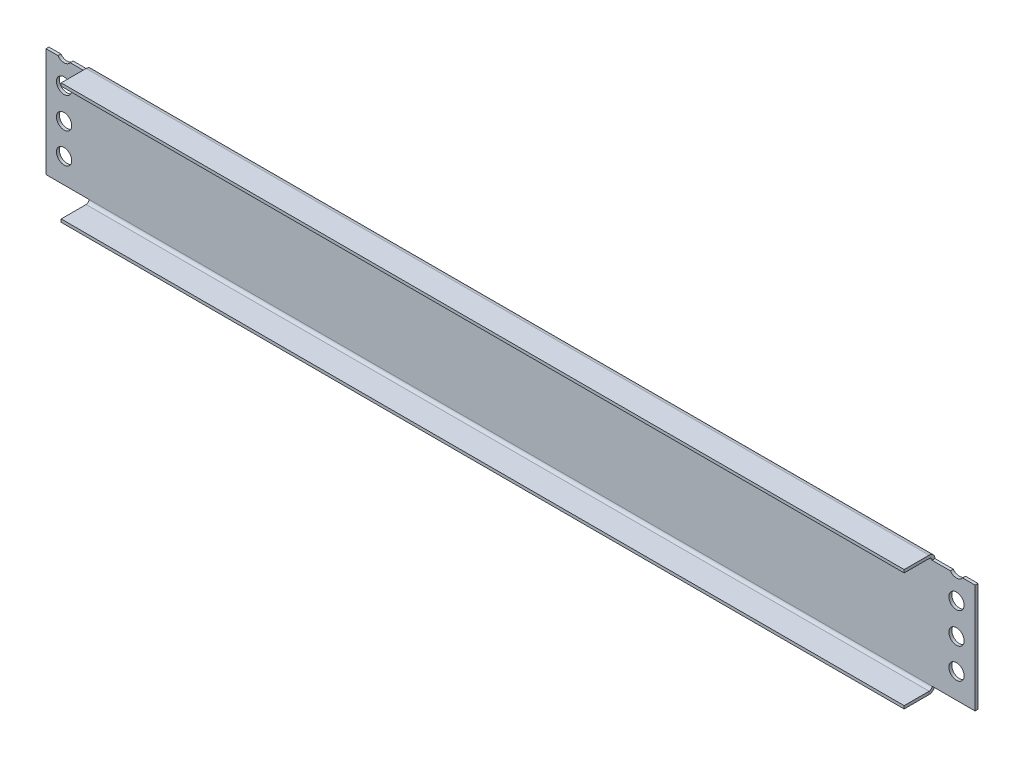
ISO-10303-21;
HEADER;
FILE_DESCRIPTION(('STEP AP214'),'2;1');
FILE_NAME('part.step','',(''),(''),'','','');
FILE_SCHEMA(('AUTOMOTIVE_DESIGN { 1 0 10303 214 1 1 1 1 }'));
ENDSEC;
DATA;
#1=APPLICATION_CONTEXT('core data for automotive mechanical design processes');
#2=APPLICATION_PROTOCOL_DEFINITION('international standard','automotive_design',2000,#1);
#3=PRODUCT_CONTEXT('',#1,'mechanical');
#4=PRODUCT('Part','Part','',(#3));
#5=PRODUCT_RELATED_PRODUCT_CATEGORY('part','',(#4));
#6=PRODUCT_DEFINITION_FORMATION('','',#4);
#7=PRODUCT_DEFINITION_CONTEXT('part definition',#1,'design');
#8=PRODUCT_DEFINITION('design','',#6,#7);
#9=PRODUCT_DEFINITION_SHAPE('','',#8);
#10=(LENGTH_UNIT() NAMED_UNIT(*) SI_UNIT(.MILLI.,.METRE.));
#11=(NAMED_UNIT(*) PLANE_ANGLE_UNIT() SI_UNIT($,.RADIAN.));
#12=(NAMED_UNIT(*) SI_UNIT($,.STERADIAN.) SOLID_ANGLE_UNIT());
#13=UNCERTAINTY_MEASURE_WITH_UNIT(LENGTH_MEASURE(1.E-05),#10,'distance_accuracy_value','');
#14=(GEOMETRIC_REPRESENTATION_CONTEXT(3) GLOBAL_UNCERTAINTY_ASSIGNED_CONTEXT((#13)) GLOBAL_UNIT_ASSIGNED_CONTEXT((#10,
#11,#12)) REPRESENTATION_CONTEXT('',''));
#15=CARTESIAN_POINT('',(0.,0.,0.));
#16=DIRECTION('',(0.,0.,1.));
#17=DIRECTION('',(1.,0.,0.));
#18=AXIS2_PLACEMENT_3D('',#15,#16,#17);
#19=CARTESIAN_POINT('',(0.,28.321,0.));
#20=DIRECTION('',(0.,1.,0.));
#21=DIRECTION('',(0.,0.,1.));
#22=AXIS2_PLACEMENT_3D('',#19,#20,#21);
#23=PLANE('',#22);
#24=DIRECTION('',(0.,0.,1.));
#25=VECTOR('',#24,1.);
#26=CARTESIAN_POINT('',(-235.089067467124,28.321,-2.794));
#27=LINE('',#26,#25);
#28=CARTESIAN_POINT('',(-235.089067467124,28.321,-1.524));
#29=VERTEX_POINT('',#28);
#30=CARTESIAN_POINT('',(-235.089067467124,28.321,0.));
#31=VERTEX_POINT('',#30);
#32=EDGE_CURVE('E13',#29,#31,#27,.T.);
#33=ORIENTED_EDGE('',*,*,#32,.F.);
#34=DIRECTION('',(-1.,0.,0.));
#35=VECTOR('',#34,1.);
#36=CARTESIAN_POINT('',(-241.3,28.321,-1.52400000000001));
#37=LINE('',#36,#35);
#38=CARTESIAN_POINT('',(-241.3,28.321,-1.52400000000001));
#39=VERTEX_POINT('',#38);
#40=EDGE_CURVE('E254',#39,#29,#37,.F.);
#41=ORIENTED_EDGE('',*,*,#40,.F.);
#42=DIRECTION('',(0.,0.,-1.));
#43=VECTOR('',#42,1.);
#44=CARTESIAN_POINT('',(-241.3,28.321,0.));
#45=LINE('',#44,#43);
#46=CARTESIAN_POINT('',(-241.3,28.321,0.));
#47=VERTEX_POINT('',#46);
#48=EDGE_CURVE('E259',#47,#39,#45,.T.);
#49=ORIENTED_EDGE('',*,*,#48,.F.);
#50=DIRECTION('',(-1.,0.,0.));
#51=VECTOR('',#50,1.);
#52=CARTESIAN_POINT('',(-241.3,28.321,0.));
#53=LINE('',#52,#51);
#54=EDGE_CURVE('E248',#47,#31,#53,.F.);
#55=ORIENTED_EDGE('',*,*,#54,.T.);
#56=EDGE_LOOP('',(#33,#41,#49,#55));
#57=FACE_BOUND('',#56,.T.);
#58=ADVANCED_FACE('F87',(#57),#23,.T.);
#59=CARTESIAN_POINT('',(0.,28.321,0.));
#60=DIRECTION('',(0.,1.,0.));
#61=DIRECTION('',(0.,0.,1.));
#62=AXIS2_PLACEMENT_3D('',#59,#60,#61);
#63=PLANE('',#62);
#64=DIRECTION('',(0.,0.,1.));
#65=VECTOR('',#64,1.);
#66=CARTESIAN_POINT('',(228.460932532876,28.321,-2.794));
#67=LINE('',#66,#65);
#68=CARTESIAN_POINT('',(228.460932532876,28.321,-1.524));
#69=VERTEX_POINT('',#68);
#70=CARTESIAN_POINT('',(228.460932532876,28.321,0.));
#71=VERTEX_POINT('',#70);
#72=EDGE_CURVE('E221',#69,#71,#67,.T.);
#73=ORIENTED_EDGE('',*,*,#72,.F.);
#74=DIRECTION('',(-1.,0.,0.));
#75=VECTOR('',#74,1.);
#76=CARTESIAN_POINT('',(218.948,28.321,-1.52400000000001));
#77=LINE('',#76,#75);
#78=CARTESIAN_POINT('',(218.948,28.321,-1.52400000000001));
#79=VERTEX_POINT('',#78);
#80=EDGE_CURVE('E309',#69,#79,#77,.T.);
#81=ORIENTED_EDGE('',*,*,#80,.T.);
#82=DIRECTION('',(0.,0.,1.));
#83=VECTOR('',#82,1.);
#84=CARTESIAN_POINT('',(218.948,28.321,-1.52400000000001));
#85=LINE('',#84,#83);
#86=CARTESIAN_POINT('',(218.948,28.321,0.));
#87=VERTEX_POINT('',#86);
#88=EDGE_CURVE('E244',#79,#87,#85,.T.);
#89=ORIENTED_EDGE('',*,*,#88,.T.);
#90=EDGE_CURVE('E236',#87,#71,#53,.F.);
#91=ORIENTED_EDGE('',*,*,#90,.T.);
#92=EDGE_LOOP('',(#73,#81,#89,#91));
#93=FACE_BOUND('',#92,.T.);
#94=ADVANCED_FACE('F242',(#93),#63,.T.);
#95=CARTESIAN_POINT('',(218.948,-28.321,14.478));
#96=DIRECTION('',(-1.,0.,0.));
#97=DIRECTION('',(0.,0.,1.));
#98=AXIS2_PLACEMENT_3D('',#95,#96,#97);
#99=PLANE('',#98);
#100=DIRECTION('',(0.,0.,-1.));
#101=VECTOR('',#100,1.);
#102=CARTESIAN_POINT('',(218.948,-31.369,14.478));
#103=LINE('',#102,#101);
#104=CARTESIAN_POINT('',(218.948,-31.369,14.478));
#105=VERTEX_POINT('',#104);
#106=CARTESIAN_POINT('',(218.948,-31.369,1.52399999999999));
#107=VERTEX_POINT('',#106);
#108=EDGE_CURVE('E483',#105,#107,#103,.T.);
#109=ORIENTED_EDGE('',*,*,#108,.T.);
#110=DIRECTION('',(0.,1.,0.));
#111=VECTOR('',#110,1.);
#112=CARTESIAN_POINT('',(218.948,-31.369,1.52399999999999));
#113=LINE('',#112,#111);
#114=CARTESIAN_POINT('',(218.948,-29.845,1.52399999999999));
#115=VERTEX_POINT('',#114);
#116=EDGE_CURVE('E286',#107,#115,#113,.T.);
#117=ORIENTED_EDGE('',*,*,#116,.T.);
#118=DIRECTION('',(0.,0.,-1.));
#119=VECTOR('',#118,1.);
#120=CARTESIAN_POINT('',(218.948,-29.845,-1.05239890875926E-13));
#121=LINE('',#120,#119);
#122=CARTESIAN_POINT('',(218.948,-29.845,14.478));
#123=VERTEX_POINT('',#122);
#124=EDGE_CURVE('E474',#123,#115,#121,.T.);
#125=ORIENTED_EDGE('',*,*,#124,.F.);
#126=DIRECTION('',(0.,1.,0.));
#127=VECTOR('',#126,1.);
#128=CARTESIAN_POINT('',(218.948,-31.369,14.478));
#129=LINE('',#128,#127);
#130=EDGE_CURVE('E280',#105,#123,#129,.T.);
#131=ORIENTED_EDGE('',*,*,#130,.F.);
#132=EDGE_LOOP('',(#109,#117,#125,#131));
#133=FACE_BOUND('',#132,.T.);
#134=ADVANCED_FACE('F499',(#133),#99,.F.);
#135=CARTESIAN_POINT('',(-218.948,28.321,-1.52400000000001));
#136=DIRECTION('',(1.,0.,0.));
#137=DIRECTION('',(0.,0.,-1.));
#138=AXIS2_PLACEMENT_3D('',#135,#136,#137);
#139=PLANE('',#138);
#140=DIRECTION('',(0.,0.,1.));
#141=VECTOR('',#140,1.);
#142=CARTESIAN_POINT('',(-218.948,31.369,-1.10560908436323E-13));
#143=LINE('',#142,#141);
#144=CARTESIAN_POINT('',(-218.948,31.369,1.52399999999998));
#145=VERTEX_POINT('',#144);
#146=CARTESIAN_POINT('',(-218.948,31.3690000000001,14.478));
#147=VERTEX_POINT('',#146);
#148=EDGE_CURVE('E411',#145,#147,#143,.T.);
#149=ORIENTED_EDGE('',*,*,#148,.F.);
#150=DIRECTION('',(0.,-1.,0.));
#151=VECTOR('',#150,1.);
#152=CARTESIAN_POINT('',(-218.948,31.369,1.52399999999998));
#153=LINE('',#152,#151);
#154=CARTESIAN_POINT('',(-218.948,29.845,1.52399999999999));
#155=VERTEX_POINT('',#154);
#156=EDGE_CURVE('E278',#145,#155,#153,.T.);
#157=ORIENTED_EDGE('',*,*,#156,.T.);
#158=DIRECTION('',(0.,0.,1.));
#159=VECTOR('',#158,1.);
#160=CARTESIAN_POINT('',(-218.948,29.845,-1.05239890875926E-13));
#161=LINE('',#160,#159);
#162=CARTESIAN_POINT('',(-218.948,29.8450000000001,14.478));
#163=VERTEX_POINT('',#162);
#164=EDGE_CURVE('E408',#155,#163,#161,.T.);
#165=ORIENTED_EDGE('',*,*,#164,.T.);
#166=DIRECTION('',(0.,-1.,0.));
#167=VECTOR('',#166,1.);
#168=CARTESIAN_POINT('',(-218.948,31.3690000000001,14.478));
#169=LINE('',#168,#167);
#170=EDGE_CURVE('E269',#147,#163,#169,.T.);
#171=ORIENTED_EDGE('',*,*,#170,.F.);
#172=EDGE_LOOP('',(#149,#157,#165,#171));
#173=FACE_BOUND('',#172,.T.);
#174=ADVANCED_FACE('F427',(#173),#139,.F.);
#175=CARTESIAN_POINT('',(0.,0.,-1.524));
#176=DIRECTION('',(0.,0.,1.));
#177=DIRECTION('',(1.,0.,0.));
#178=AXIS2_PLACEMENT_3D('',#175,#176,#177);
#179=PLANE('',#178);
#180=CARTESIAN_POINT('',(231.648,0.380999999999958,-1.524));
#181=DIRECTION('',(0.,0.,1.));
#182=DIRECTION('',(1.,0.,0.));
#183=AXIS2_PLACEMENT_3D('',#180,#181,#182);
#184=CIRCLE('',#183,3.9624);
#185=CARTESIAN_POINT('',(235.6104,0.380999999999958,-1.524));
#186=VERTEX_POINT('',#185);
#187=EDGE_CURVE('E360',#186,#186,#184,.T.);
#188=ORIENTED_EDGE('',*,*,#187,.T.);
#189=EDGE_LOOP('',(#188));
#190=FACE_BOUND('',#189,.T.);
#191=CARTESIAN_POINT('',(231.648,-15.367,-1.524));
#192=DIRECTION('',(0.,0.,1.));
#193=DIRECTION('',(1.,0.,0.));
#194=AXIS2_PLACEMENT_3D('',#191,#192,#193);
#195=CIRCLE('',#194,3.9624);
#196=CARTESIAN_POINT('',(235.6104,-15.367,-1.524));
#197=VERTEX_POINT('',#196);
#198=EDGE_CURVE('E357',#197,#197,#195,.T.);
#199=ORIENTED_EDGE('',*,*,#198,.T.);
#200=EDGE_LOOP('',(#199));
#201=FACE_BOUND('',#200,.T.);
#202=CARTESIAN_POINT('',(-231.902,16.383,-1.524));
#203=DIRECTION('',(0.,0.,1.));
#204=DIRECTION('',(1.,0.,0.));
#205=AXIS2_PLACEMENT_3D('',#202,#203,#204);
#206=CIRCLE('',#205,3.9624);
#207=CARTESIAN_POINT('',(-227.9396,16.383,-1.524));
#208=VERTEX_POINT('',#207);
#209=EDGE_CURVE('E354',#208,#208,#206,.T.);
#210=ORIENTED_EDGE('',*,*,#209,.T.);
#211=EDGE_LOOP('',(#210));
#212=FACE_BOUND('',#211,.T.);
#213=CARTESIAN_POINT('',(-231.902,0.380999999999958,-1.524));
#214=DIRECTION('',(0.,0.,1.));
#215=DIRECTION('',(1.,0.,0.));
#216=AXIS2_PLACEMENT_3D('',#213,#214,#215);
#217=CIRCLE('',#216,3.9624);
#218=CARTESIAN_POINT('',(-227.9396,0.380999999999958,-1.524));
#219=VERTEX_POINT('',#218);
#220=EDGE_CURVE('E351',#219,#219,#217,.T.);
#221=ORIENTED_EDGE('',*,*,#220,.T.);
#222=EDGE_LOOP('',(#221));
#223=FACE_BOUND('',#222,.T.);
#224=CARTESIAN_POINT('',(-231.902,-15.367,-1.524));
#225=DIRECTION('',(0.,0.,1.));
#226=DIRECTION('',(1.,0.,0.));
#227=AXIS2_PLACEMENT_3D('',#224,#225,#226);
#228=CIRCLE('',#227,3.9624);
#229=CARTESIAN_POINT('',(-227.9396,-15.367,-1.524));
#230=VERTEX_POINT('',#229);
#231=EDGE_CURVE('E348',#230,#230,#228,.T.);
#232=ORIENTED_EDGE('',*,*,#231,.T.);
#233=EDGE_LOOP('',(#232));
#234=FACE_BOUND('',#233,.T.);
#235=CARTESIAN_POINT('',(231.648,16.383,-1.524));
#236=DIRECTION('',(0.,0.,1.));
#237=DIRECTION('',(1.,0.,0.));
#238=AXIS2_PLACEMENT_3D('',#235,#236,#237);
#239=CIRCLE('',#238,3.9624);
#240=CARTESIAN_POINT('',(235.6104,16.383,-1.524));
#241=VERTEX_POINT('',#240);
#242=EDGE_CURVE('E345',#241,#241,#239,.T.);
#243=ORIENTED_EDGE('',*,*,#242,.T.);
#244=EDGE_LOOP('',(#243));
#245=FACE_BOUND('',#244,.T.);
#246=ORIENTED_EDGE('',*,*,#40,.T.);
#247=CARTESIAN_POINT('',(-231.902,30.6324,-1.524));
#248=DIRECTION('',(0.,0.,1.));
#249=DIRECTION('',(1.,0.,0.));
#250=AXIS2_PLACEMENT_3D('',#247,#248,#249);
#251=CIRCLE('',#250,3.937);
#252=CARTESIAN_POINT('',(-228.714932532876,28.321,-1.52400000000001));
#253=VERTEX_POINT('',#252);
#254=EDGE_CURVE('E290',#29,#253,#251,.T.);
#255=ORIENTED_EDGE('',*,*,#254,.T.);
#256=CARTESIAN_POINT('',(-218.948,28.321,-1.52400000000001));
#257=VERTEX_POINT('',#256);
#258=EDGE_CURVE('E299',#253,#257,#37,.F.);
#259=ORIENTED_EDGE('',*,*,#258,.T.);
#260=EDGE_CURVE('E253',#257,#79,#37,.F.);
#261=ORIENTED_EDGE('',*,*,#260,.T.);
#262=ORIENTED_EDGE('',*,*,#80,.F.);
#263=CARTESIAN_POINT('',(231.648,30.6324,-1.524));
#264=DIRECTION('',(0.,0.,1.));
#265=DIRECTION('',(1.,0.,0.));
#266=AXIS2_PLACEMENT_3D('',#263,#264,#265);
#267=CIRCLE('',#266,3.937);
#268=CARTESIAN_POINT('',(234.835067467124,28.321,-1.52400000000001));
#269=VERTEX_POINT('',#268);
#270=EDGE_CURVE('E224',#69,#269,#267,.T.);
#271=ORIENTED_EDGE('',*,*,#270,.T.);
#272=CARTESIAN_POINT('',(241.3,28.321,-1.52400000000001));
#273=VERTEX_POINT('',#272);
#274=EDGE_CURVE('E413',#273,#269,#77,.T.);
#275=ORIENTED_EDGE('',*,*,#274,.F.);
#276=DIRECTION('',(0.,1.,0.));
#277=VECTOR('',#276,1.);
#278=CARTESIAN_POINT('',(241.3,31.369,-1.524));
#279=LINE('',#278,#277);
#280=CARTESIAN_POINT('',(241.3,-28.321,-1.524));
#281=VERTEX_POINT('',#280);
#282=EDGE_CURVE('E262',#281,#273,#279,.T.);
#283=ORIENTED_EDGE('',*,*,#282,.F.);
#284=DIRECTION('',(1.,0.,0.));
#285=VECTOR('',#284,1.);
#286=CARTESIAN_POINT('',(241.3,-28.321,-1.524));
#287=LINE('',#286,#285);
#288=CARTESIAN_POINT('',(218.948,-28.321,-1.524));
#289=VERTEX_POINT('',#288);
#290=EDGE_CURVE('E376',#281,#289,#287,.F.);
#291=ORIENTED_EDGE('',*,*,#290,.T.);
#292=CARTESIAN_POINT('',(-218.948,-28.321,-1.524));
#293=VERTEX_POINT('',#292);
#294=EDGE_CURVE('E380',#289,#293,#287,.F.);
#295=ORIENTED_EDGE('',*,*,#294,.T.);
#296=DIRECTION('',(1.,0.,0.));
#297=VECTOR('',#296,1.);
#298=CARTESIAN_POINT('',(-241.3,-28.321,-1.524));
#299=LINE('',#298,#297);
#300=CARTESIAN_POINT('',(-241.3,-28.321,-1.524));
#301=VERTEX_POINT('',#300);
#302=EDGE_CURVE('E472',#301,#293,#299,.T.);
#303=ORIENTED_EDGE('',*,*,#302,.F.);
#304=DIRECTION('',(0.,-1.,0.));
#305=VECTOR('',#304,1.);
#306=CARTESIAN_POINT('',(-241.3,31.369,-1.524));
#307=LINE('',#306,#305);
#308=EDGE_CURVE('E265',#39,#301,#307,.T.);
#309=ORIENTED_EDGE('',*,*,#308,.F.);
#310=EDGE_LOOP('',(#246,#255,#259,#261,#262,#271,#275,#283,#291,#295,#303,#309));
#311=FACE_BOUND('',#310,.T.);
#312=ADVANCED_FACE('F297',(#190,#201,#212,#223,#234,#245,#311),#179,.F.);
#313=CARTESIAN_POINT('',(0.,0.,0.));
#314=DIRECTION('',(0.,0.,1.));
#315=DIRECTION('',(1.,0.,0.));
#316=AXIS2_PLACEMENT_3D('',#313,#314,#315);
#317=PLANE('',#316);
#318=CARTESIAN_POINT('',(-231.902,30.6324,0.));
#319=DIRECTION('',(0.,0.,1.));
#320=DIRECTION('',(1.,0.,0.));
#321=AXIS2_PLACEMENT_3D('',#318,#319,#320);
#322=CIRCLE('',#321,3.937);
#323=CARTESIAN_POINT('',(-228.714932532876,28.321,0.));
#324=VERTEX_POINT('',#323);
#325=EDGE_CURVE('E101',#31,#324,#322,.T.);
#326=ORIENTED_EDGE('',*,*,#325,.F.);
#327=ORIENTED_EDGE('',*,*,#54,.F.);
#328=DIRECTION('',(0.,-1.,0.));
#329=VECTOR('',#328,1.);
#330=CARTESIAN_POINT('',(-241.3,31.369,0.));
#331=LINE('',#330,#329);
#332=CARTESIAN_POINT('',(-241.3,-28.321,0.));
#333=VERTEX_POINT('',#332);
#334=EDGE_CURVE('E266',#47,#333,#331,.T.);
#335=ORIENTED_EDGE('',*,*,#334,.T.);
#336=DIRECTION('',(1.,0.,0.));
#337=VECTOR('',#336,1.);
#338=CARTESIAN_POINT('',(241.3,-28.321,0.));
#339=LINE('',#338,#337);
#340=CARTESIAN_POINT('',(-218.948,-28.321,0.));
#341=VERTEX_POINT('',#340);
#342=EDGE_CURVE('E367',#341,#333,#339,.F.);
#343=ORIENTED_EDGE('',*,*,#342,.F.);
#344=CARTESIAN_POINT('',(218.948,-28.321,0.));
#345=VERTEX_POINT('',#344);
#346=EDGE_CURVE('E383',#345,#341,#339,.F.);
#347=ORIENTED_EDGE('',*,*,#346,.F.);
#348=CARTESIAN_POINT('',(241.3,-28.321,0.));
#349=VERTEX_POINT('',#348);
#350=EDGE_CURVE('E381',#349,#345,#339,.F.);
#351=ORIENTED_EDGE('',*,*,#350,.F.);
#352=DIRECTION('',(0.,1.,0.));
#353=VECTOR('',#352,1.);
#354=CARTESIAN_POINT('',(241.3,31.369,0.));
#355=LINE('',#354,#353);
#356=CARTESIAN_POINT('',(241.3,28.321,0.));
#357=VERTEX_POINT('',#356);
#358=EDGE_CURVE('E258',#349,#357,#355,.T.);
#359=ORIENTED_EDGE('',*,*,#358,.T.);
#360=CARTESIAN_POINT('',(234.835067467124,28.321,0.));
#361=VERTEX_POINT('',#360);
#362=EDGE_CURVE('E239',#361,#357,#53,.F.);
#363=ORIENTED_EDGE('',*,*,#362,.F.);
#364=CARTESIAN_POINT('',(231.648,30.6324,0.));
#365=DIRECTION('',(0.,0.,1.));
#366=DIRECTION('',(1.,0.,0.));
#367=AXIS2_PLACEMENT_3D('',#364,#365,#366);
#368=CIRCLE('',#367,3.937);
#369=EDGE_CURVE('E109',#71,#361,#368,.T.);
#370=ORIENTED_EDGE('',*,*,#369,.F.);
#371=ORIENTED_EDGE('',*,*,#90,.F.);
#372=CARTESIAN_POINT('',(-218.948,28.321,0.));
#373=VERTEX_POINT('',#372);
#374=EDGE_CURVE('E245',#373,#87,#53,.F.);
#375=ORIENTED_EDGE('',*,*,#374,.F.);
#376=EDGE_CURVE('E247',#324,#373,#53,.F.);
#377=ORIENTED_EDGE('',*,*,#376,.F.);
#378=EDGE_LOOP('',(#326,#327,#335,#343,#347,#351,#359,#363,#370,#371,#375,#377));
#379=FACE_BOUND('',#378,.T.);
#380=CARTESIAN_POINT('',(231.648,0.380999999999958,0.));
#381=DIRECTION('',(0.,0.,1.));
#382=DIRECTION('',(1.,0.,0.));
#383=AXIS2_PLACEMENT_3D('',#380,#381,#382);
#384=CIRCLE('',#383,3.9624);
#385=CARTESIAN_POINT('',(235.6104,0.380999999999958,0.));
#386=VERTEX_POINT('',#385);
#387=EDGE_CURVE('E331',#386,#386,#384,.T.);
#388=ORIENTED_EDGE('',*,*,#387,.F.);
#389=EDGE_LOOP('',(#388));
#390=FACE_BOUND('',#389,.T.);
#391=CARTESIAN_POINT('',(231.648,-15.367,0.));
#392=DIRECTION('',(0.,0.,1.));
#393=DIRECTION('',(1.,0.,0.));
#394=AXIS2_PLACEMENT_3D('',#391,#392,#393);
#395=CIRCLE('',#394,3.9624);
#396=CARTESIAN_POINT('',(235.6104,-15.367,0.));
#397=VERTEX_POINT('',#396);
#398=EDGE_CURVE('E335',#397,#397,#395,.T.);
#399=ORIENTED_EDGE('',*,*,#398,.F.);
#400=EDGE_LOOP('',(#399));
#401=FACE_BOUND('',#400,.T.);
#402=CARTESIAN_POINT('',(-231.902,16.383,0.));
#403=DIRECTION('',(0.,0.,1.));
#404=DIRECTION('',(1.,0.,0.));
#405=AXIS2_PLACEMENT_3D('',#402,#403,#404);
#406=CIRCLE('',#405,3.9624);
#407=CARTESIAN_POINT('',(-227.9396,16.383,0.));
#408=VERTEX_POINT('',#407);
#409=EDGE_CURVE('E338',#408,#408,#406,.T.);
#410=ORIENTED_EDGE('',*,*,#409,.F.);
#411=EDGE_LOOP('',(#410));
#412=FACE_BOUND('',#411,.T.);
#413=CARTESIAN_POINT('',(-231.902,0.380999999999958,0.));
#414=DIRECTION('',(0.,0.,1.));
#415=DIRECTION('',(1.,0.,0.));
#416=AXIS2_PLACEMENT_3D('',#413,#414,#415);
#417=CIRCLE('',#416,3.9624);
#418=CARTESIAN_POINT('',(-227.9396,0.380999999999958,0.));
#419=VERTEX_POINT('',#418);
#420=EDGE_CURVE('E325',#419,#419,#417,.T.);
#421=ORIENTED_EDGE('',*,*,#420,.F.);
#422=EDGE_LOOP('',(#421));
#423=FACE_BOUND('',#422,.T.);
#424=CARTESIAN_POINT('',(-231.902,-15.367,0.));
#425=DIRECTION('',(0.,0.,1.));
#426=DIRECTION('',(1.,0.,0.));
#427=AXIS2_PLACEMENT_3D('',#424,#425,#426);
#428=CIRCLE('',#427,3.9624);
#429=CARTESIAN_POINT('',(-227.9396,-15.367,0.));
#430=VERTEX_POINT('',#429);
#431=EDGE_CURVE('E321',#430,#430,#428,.T.);
#432=ORIENTED_EDGE('',*,*,#431,.F.);
#433=EDGE_LOOP('',(#432));
#434=FACE_BOUND('',#433,.T.);
#435=CARTESIAN_POINT('',(231.648,16.383,0.));
#436=DIRECTION('',(0.,0.,1.));
#437=DIRECTION('',(1.,0.,0.));
#438=AXIS2_PLACEMENT_3D('',#435,#436,#437);
#439=CIRCLE('',#438,3.9624);
#440=CARTESIAN_POINT('',(235.6104,16.383,0.));
#441=VERTEX_POINT('',#440);
#442=EDGE_CURVE('E334',#441,#441,#439,.T.);
#443=ORIENTED_EDGE('',*,*,#442,.F.);
#444=EDGE_LOOP('',(#443));
#445=FACE_BOUND('',#444,.T.);
#446=ADVANCED_FACE('F233',(#379,#390,#401,#412,#423,#434,#445),#317,.T.);
#447=CARTESIAN_POINT('',(241.3,31.369,-1.524));
#448=DIRECTION('',(1.,0.,0.));
#449=DIRECTION('',(0.,0.,-1.));
#450=AXIS2_PLACEMENT_3D('',#447,#448,#449);
#451=PLANE('',#450);
#452=ORIENTED_EDGE('',*,*,#358,.F.);
#453=DIRECTION('',(0.,0.,-1.));
#454=VECTOR('',#453,1.);
#455=CARTESIAN_POINT('',(241.3,-28.321,0.));
#456=LINE('',#455,#454);
#457=EDGE_CURVE('E379',#349,#281,#456,.T.);
#458=ORIENTED_EDGE('',*,*,#457,.T.);
#459=ORIENTED_EDGE('',*,*,#282,.T.);
#460=DIRECTION('',(0.,0.,-1.));
#461=VECTOR('',#460,1.);
#462=CARTESIAN_POINT('',(241.3,28.321,0.));
#463=LINE('',#462,#461);
#464=EDGE_CURVE('E256',#357,#273,#463,.T.);
#465=ORIENTED_EDGE('',*,*,#464,.F.);
#466=EDGE_LOOP('',(#452,#458,#459,#465));
#467=FACE_BOUND('',#466,.T.);
#468=ADVANCED_FACE('F89',(#467),#451,.T.);
#469=CARTESIAN_POINT('',(-241.3,31.369,-1.524));
#470=DIRECTION('',(-1.,0.,0.));
#471=DIRECTION('',(0.,0.,1.));
#472=AXIS2_PLACEMENT_3D('',#469,#470,#471);
#473=PLANE('',#472);
#474=DIRECTION('',(0.,0.,-1.));
#475=VECTOR('',#474,1.);
#476=CARTESIAN_POINT('',(-241.3,-28.321,0.));
#477=LINE('',#476,#475);
#478=EDGE_CURVE('E384',#333,#301,#477,.T.);
#479=ORIENTED_EDGE('',*,*,#478,.F.);
#480=ORIENTED_EDGE('',*,*,#334,.F.);
#481=ORIENTED_EDGE('',*,*,#48,.T.);
#482=ORIENTED_EDGE('',*,*,#308,.T.);
#483=EDGE_LOOP('',(#479,#480,#481,#482));
#484=FACE_BOUND('',#483,.T.);
#485=ADVANCED_FACE('F468',(#484),#473,.T.);
#486=CARTESIAN_POINT('',(-241.3,28.321,1.524));
#487=DIRECTION('',(-1.,0.,0.));
#488=DIRECTION('',(0.,1.,0.));
#489=AXIS2_PLACEMENT_3D('',#486,#487,#488);
#490=CYLINDRICAL_SURFACE('',#489,3.048);
#491=CARTESIAN_POINT('',(218.948,28.321,1.524));
#492=DIRECTION('',(-1.,0.,0.));
#493=DIRECTION('',(0.,0.,1.));
#494=AXIS2_PLACEMENT_3D('',#491,#492,#493);
#495=CIRCLE('',#494,3.048);
#496=CARTESIAN_POINT('',(218.948,31.369,1.52399999999998));
#497=VERTEX_POINT('',#496);
#498=EDGE_CURVE('E317',#79,#497,#495,.F.);
#499=ORIENTED_EDGE('',*,*,#498,.F.);
#500=ORIENTED_EDGE('',*,*,#260,.F.);
#501=CARTESIAN_POINT('',(-218.948,28.321,1.524));
#502=DIRECTION('',(1.,0.,0.));
#503=DIRECTION('',(0.,0.,-1.));
#504=AXIS2_PLACEMENT_3D('',#501,#502,#503);
#505=CIRCLE('',#504,3.048);
#506=EDGE_CURVE('E315',#145,#257,#505,.F.);
#507=ORIENTED_EDGE('',*,*,#506,.F.);
#508=DIRECTION('',(-1.,0.,0.));
#509=VECTOR('',#508,1.);
#510=CARTESIAN_POINT('',(241.3,31.369,1.52399999999999));
#511=LINE('',#510,#509);
#512=EDGE_CURVE('E318',#145,#497,#511,.F.);
#513=ORIENTED_EDGE('',*,*,#512,.T.);
#514=EDGE_LOOP('',(#499,#500,#507,#513));
#515=FACE_BOUND('',#514,.T.);
#516=ADVANCED_FACE('F313',(#515),#490,.T.);
#517=CARTESIAN_POINT('',(-241.3,28.321,1.524));
#518=DIRECTION('',(-1.,0.,0.));
#519=DIRECTION('',(0.,1.,0.));
#520=AXIS2_PLACEMENT_3D('',#517,#518,#519);
#521=CYLINDRICAL_SURFACE('',#520,1.524);
#522=ORIENTED_EDGE('',*,*,#374,.T.);
#523=CARTESIAN_POINT('',(218.948,28.321,1.524));
#524=DIRECTION('',(-1.,0.,0.));
#525=DIRECTION('',(0.,0.,1.));
#526=AXIS2_PLACEMENT_3D('',#523,#524,#525);
#527=CIRCLE('',#526,1.524);
#528=CARTESIAN_POINT('',(218.948,29.845,1.52399999999999));
#529=VERTEX_POINT('',#528);
#530=EDGE_CURVE('E327',#87,#529,#527,.F.);
#531=ORIENTED_EDGE('',*,*,#530,.T.);
#532=DIRECTION('',(-1.,0.,0.));
#533=VECTOR('',#532,1.);
#534=CARTESIAN_POINT('',(241.3,29.845,1.52399999999999));
#535=LINE('',#534,#533);
#536=EDGE_CURVE('E386',#529,#155,#535,.T.);
#537=ORIENTED_EDGE('',*,*,#536,.T.);
#538=CARTESIAN_POINT('',(-218.948,28.321,1.524));
#539=DIRECTION('',(1.,0.,0.));
#540=DIRECTION('',(0.,0.,-1.));
#541=AXIS2_PLACEMENT_3D('',#538,#539,#540);
#542=CIRCLE('',#541,1.524);
#543=EDGE_CURVE('E401',#155,#373,#542,.F.);
#544=ORIENTED_EDGE('',*,*,#543,.T.);
#545=EDGE_LOOP('',(#522,#531,#537,#544));
#546=FACE_BOUND('',#545,.T.);
#547=ADVANCED_FACE('F399',(#546),#521,.F.);
#548=CARTESIAN_POINT('',(0.,31.369,-1.10560908436323E-13));
#549=DIRECTION('',(0.,-1.,0.));
#550=DIRECTION('',(0.,0.,-1.));
#551=AXIS2_PLACEMENT_3D('',#548,#549,#550);
#552=PLANE('',#551);
#553=DIRECTION('',(1.,0.,0.));
#554=VECTOR('',#553,1.);
#555=CARTESIAN_POINT('',(0.,31.3690000000001,14.478));
#556=LINE('',#555,#554);
#557=CARTESIAN_POINT('',(218.948,31.3690000000001,14.478));
#558=VERTEX_POINT('',#557);
#559=EDGE_CURVE('E249',#147,#558,#556,.T.);
#560=ORIENTED_EDGE('',*,*,#559,.T.);
#561=DIRECTION('',(0.,0.,-1.));
#562=VECTOR('',#561,1.);
#563=CARTESIAN_POINT('',(218.948,31.369,-1.10560908436323E-13));
#564=LINE('',#563,#562);
#565=EDGE_CURVE('E322',#558,#497,#564,.T.);
#566=ORIENTED_EDGE('',*,*,#565,.T.);
#567=ORIENTED_EDGE('',*,*,#512,.F.);
#568=ORIENTED_EDGE('',*,*,#148,.T.);
#569=EDGE_LOOP('',(#560,#566,#567,#568));
#570=FACE_BOUND('',#569,.T.);
#571=ADVANCED_FACE('F425',(#570),#552,.F.);
#572=CARTESIAN_POINT('',(0.,29.845,-1.05239890875926E-13));
#573=DIRECTION('',(0.,-1.,0.));
#574=DIRECTION('',(0.,0.,-1.));
#575=AXIS2_PLACEMENT_3D('',#572,#573,#574);
#576=PLANE('',#575);
#577=DIRECTION('',(0.,0.,-1.));
#578=VECTOR('',#577,1.);
#579=CARTESIAN_POINT('',(218.948,29.845,-1.05239890875926E-13));
#580=LINE('',#579,#578);
#581=CARTESIAN_POINT('',(218.948,29.8450000000001,14.478));
#582=VERTEX_POINT('',#581);
#583=EDGE_CURVE('E407',#582,#529,#580,.T.);
#584=ORIENTED_EDGE('',*,*,#583,.F.);
#585=DIRECTION('',(-1.,0.,0.));
#586=VECTOR('',#585,1.);
#587=CARTESIAN_POINT('',(241.3,29.8450000000001,14.478));
#588=LINE('',#587,#586);
#589=EDGE_CURVE('E391',#163,#582,#588,.F.);
#590=ORIENTED_EDGE('',*,*,#589,.F.);
#591=ORIENTED_EDGE('',*,*,#164,.F.);
#592=ORIENTED_EDGE('',*,*,#536,.F.);
#593=EDGE_LOOP('',(#584,#590,#591,#592));
#594=FACE_BOUND('',#593,.T.);
#595=ADVANCED_FACE('F405',(#594),#576,.T.);
#596=CARTESIAN_POINT('',(241.3,31.3690000000001,14.478));
#597=DIRECTION('',(0.,0.,-1.));
#598=DIRECTION('',(0.,1.,0.));
#599=AXIS2_PLACEMENT_3D('',#596,#597,#598);
#600=PLANE('',#599);
#601=ORIENTED_EDGE('',*,*,#589,.T.);
#602=DIRECTION('',(0.,1.,0.));
#603=VECTOR('',#602,1.);
#604=CARTESIAN_POINT('',(218.948,31.3690000000001,14.478));
#605=LINE('',#604,#603);
#606=EDGE_CURVE('E275',#582,#558,#605,.T.);
#607=ORIENTED_EDGE('',*,*,#606,.T.);
#608=ORIENTED_EDGE('',*,*,#559,.F.);
#609=ORIENTED_EDGE('',*,*,#170,.T.);
#610=EDGE_LOOP('',(#601,#607,#608,#609));
#611=FACE_BOUND('',#610,.T.);
#612=ADVANCED_FACE('F423',(#611),#600,.F.);
#613=CARTESIAN_POINT('',(241.3,-28.321,1.524));
#614=DIRECTION('',(1.,0.,0.));
#615=DIRECTION('',(0.,-1.,0.));
#616=AXIS2_PLACEMENT_3D('',#613,#614,#615);
#617=CYLINDRICAL_SURFACE('',#616,3.048);
#618=CARTESIAN_POINT('',(-218.948,-28.321,1.524));
#619=DIRECTION('',(1.,0.,0.));
#620=DIRECTION('',(0.,0.,-1.));
#621=AXIS2_PLACEMENT_3D('',#618,#619,#620);
#622=CIRCLE('',#621,3.048);
#623=CARTESIAN_POINT('',(-218.948,-31.369,1.52399999999999));
#624=VERTEX_POINT('',#623);
#625=EDGE_CURVE('E430',#293,#624,#622,.F.);
#626=ORIENTED_EDGE('',*,*,#625,.F.);
#627=ORIENTED_EDGE('',*,*,#294,.F.);
#628=CARTESIAN_POINT('',(218.948,-28.321,1.524));
#629=DIRECTION('',(-1.,0.,0.));
#630=DIRECTION('',(0.,0.,1.));
#631=AXIS2_PLACEMENT_3D('',#628,#629,#630);
#632=CIRCLE('',#631,3.048);
#633=EDGE_CURVE('E488',#107,#289,#632,.F.);
#634=ORIENTED_EDGE('',*,*,#633,.F.);
#635=DIRECTION('',(1.,0.,0.));
#636=VECTOR('',#635,1.);
#637=CARTESIAN_POINT('',(0.,-31.369,1.52399999999999));
#638=LINE('',#637,#636);
#639=EDGE_CURVE('E371',#624,#107,#638,.T.);
#640=ORIENTED_EDGE('',*,*,#639,.F.);
#641=EDGE_LOOP('',(#626,#627,#634,#640));
#642=FACE_BOUND('',#641,.T.);
#643=ADVANCED_FACE('F505',(#642),#617,.T.);
#644=CARTESIAN_POINT('',(241.3,-28.321,1.524));
#645=DIRECTION('',(1.,0.,0.));
#646=DIRECTION('',(0.,-1.,0.));
#647=AXIS2_PLACEMENT_3D('',#644,#645,#646);
#648=CYLINDRICAL_SURFACE('',#647,1.524);
#649=ORIENTED_EDGE('',*,*,#346,.T.);
#650=CARTESIAN_POINT('',(-218.948,-28.321,1.524));
#651=DIRECTION('',(1.,0.,0.));
#652=DIRECTION('',(0.,0.,-1.));
#653=AXIS2_PLACEMENT_3D('',#650,#651,#652);
#654=CIRCLE('',#653,1.524);
#655=CARTESIAN_POINT('',(-218.948,-29.845,1.52399999999999));
#656=VERTEX_POINT('',#655);
#657=EDGE_CURVE('E432',#341,#656,#654,.F.);
#658=ORIENTED_EDGE('',*,*,#657,.T.);
#659=DIRECTION('',(-1.,0.,0.));
#660=VECTOR('',#659,1.);
#661=CARTESIAN_POINT('',(-241.3,-29.845,1.52399999999999));
#662=LINE('',#661,#660);
#663=EDGE_CURVE('E363',#656,#115,#662,.F.);
#664=ORIENTED_EDGE('',*,*,#663,.T.);
#665=CARTESIAN_POINT('',(218.948,-28.321,1.524));
#666=DIRECTION('',(-1.,0.,0.));
#667=DIRECTION('',(0.,0.,1.));
#668=AXIS2_PLACEMENT_3D('',#665,#666,#667);
#669=CIRCLE('',#668,1.524);
#670=EDGE_CURVE('E477',#115,#345,#669,.F.);
#671=ORIENTED_EDGE('',*,*,#670,.T.);
#672=EDGE_LOOP('',(#649,#658,#664,#671));
#673=FACE_BOUND('',#672,.T.);
#674=ADVANCED_FACE('F509',(#673),#648,.F.);
#675=CARTESIAN_POINT('',(0.,-31.369,-1.10560908436323E-13));
#676=DIRECTION('',(0.,-1.,0.));
#677=DIRECTION('',(0.,0.,-1.));
#678=AXIS2_PLACEMENT_3D('',#675,#676,#677);
#679=PLANE('',#678);
#680=DIRECTION('',(0.,0.,1.));
#681=VECTOR('',#680,1.);
#682=CARTESIAN_POINT('',(-218.948,-31.369,14.478));
#683=LINE('',#682,#681);
#684=CARTESIAN_POINT('',(-218.948,-31.369,14.478));
#685=VERTEX_POINT('',#684);
#686=EDGE_CURVE('E479',#624,#685,#683,.T.);
#687=ORIENTED_EDGE('',*,*,#686,.F.);
#688=ORIENTED_EDGE('',*,*,#639,.T.);
#689=ORIENTED_EDGE('',*,*,#108,.F.);
#690=DIRECTION('',(1.,0.,0.));
#691=VECTOR('',#690,1.);
#692=CARTESIAN_POINT('',(0.,-31.369,14.478));
#693=LINE('',#692,#691);
#694=EDGE_CURVE('E364',#105,#685,#693,.F.);
#695=ORIENTED_EDGE('',*,*,#694,.T.);
#696=EDGE_LOOP('',(#687,#688,#689,#695));
#697=FACE_BOUND('',#696,.T.);
#698=ADVANCED_FACE('F502',(#697),#679,.T.);
#699=CARTESIAN_POINT('',(0.,-29.845,-1.05239890875926E-13));
#700=DIRECTION('',(0.,-1.,0.));
#701=DIRECTION('',(0.,0.,-1.));
#702=AXIS2_PLACEMENT_3D('',#699,#700,#701);
#703=PLANE('',#702);
#704=ORIENTED_EDGE('',*,*,#663,.F.);
#705=DIRECTION('',(0.,0.,1.));
#706=VECTOR('',#705,1.);
#707=CARTESIAN_POINT('',(-218.948,-29.845,-1.05239890875926E-13));
#708=LINE('',#707,#706);
#709=CARTESIAN_POINT('',(-218.948,-29.845,14.478));
#710=VERTEX_POINT('',#709);
#711=EDGE_CURVE('E438',#656,#710,#708,.T.);
#712=ORIENTED_EDGE('',*,*,#711,.T.);
#713=DIRECTION('',(-1.,0.,0.));
#714=VECTOR('',#713,1.);
#715=CARTESIAN_POINT('',(241.3,-29.845,14.478));
#716=LINE('',#715,#714);
#717=EDGE_CURVE('E368',#123,#710,#716,.T.);
#718=ORIENTED_EDGE('',*,*,#717,.F.);
#719=ORIENTED_EDGE('',*,*,#124,.T.);
#720=EDGE_LOOP('',(#704,#712,#718,#719));
#721=FACE_BOUND('',#720,.T.);
#722=ADVANCED_FACE('F493',(#721),#703,.F.);
#723=CARTESIAN_POINT('',(241.3,-31.369,14.478));
#724=DIRECTION('',(0.,0.,-1.));
#725=DIRECTION('',(0.,1.,0.));
#726=AXIS2_PLACEMENT_3D('',#723,#724,#725);
#727=PLANE('',#726);
#728=ORIENTED_EDGE('',*,*,#717,.T.);
#729=DIRECTION('',(0.,-1.,0.));
#730=VECTOR('',#729,1.);
#731=CARTESIAN_POINT('',(-218.948,-31.369,14.478));
#732=LINE('',#731,#730);
#733=EDGE_CURVE('E283',#710,#685,#732,.T.);
#734=ORIENTED_EDGE('',*,*,#733,.T.);
#735=ORIENTED_EDGE('',*,*,#694,.F.);
#736=ORIENTED_EDGE('',*,*,#130,.T.);
#737=EDGE_LOOP('',(#728,#734,#735,#736));
#738=FACE_BOUND('',#737,.T.);
#739=ADVANCED_FACE('F495',(#738),#727,.F.);
#740=CARTESIAN_POINT('',(231.648,16.383,-58.166));
#741=DIRECTION('',(0.,0.,1.));
#742=DIRECTION('',(1.,0.,0.));
#743=AXIS2_PLACEMENT_3D('',#740,#741,#742);
#744=CYLINDRICAL_SURFACE('',#743,3.9624);
#745=ORIENTED_EDGE('',*,*,#442,.T.);
#746=EDGE_LOOP('',(#745));
#747=FACE_BOUND('',#746,.T.);
#748=ORIENTED_EDGE('',*,*,#242,.F.);
#749=EDGE_LOOP('',(#748));
#750=FACE_BOUND('',#749,.T.);
#751=ADVANCED_FACE('F556',(#747,#750),#744,.F.);
#752=CARTESIAN_POINT('',(-231.902,-15.367,-58.166));
#753=DIRECTION('',(0.,0.,1.));
#754=DIRECTION('',(1.,0.,0.));
#755=AXIS2_PLACEMENT_3D('',#752,#753,#754);
#756=CYLINDRICAL_SURFACE('',#755,3.9624);
#757=ORIENTED_EDGE('',*,*,#431,.T.);
#758=EDGE_LOOP('',(#757));
#759=FACE_BOUND('',#758,.T.);
#760=ORIENTED_EDGE('',*,*,#231,.F.);
#761=EDGE_LOOP('',(#760));
#762=FACE_BOUND('',#761,.T.);
#763=ADVANCED_FACE('F547',(#759,#762),#756,.F.);
#764=CARTESIAN_POINT('',(-231.902,0.380999999999958,-58.166));
#765=DIRECTION('',(0.,0.,1.));
#766=DIRECTION('',(1.,0.,0.));
#767=AXIS2_PLACEMENT_3D('',#764,#765,#766);
#768=CYLINDRICAL_SURFACE('',#767,3.9624);
#769=ORIENTED_EDGE('',*,*,#420,.T.);
#770=EDGE_LOOP('',(#769));
#771=FACE_BOUND('',#770,.T.);
#772=ORIENTED_EDGE('',*,*,#220,.F.);
#773=EDGE_LOOP('',(#772));
#774=FACE_BOUND('',#773,.T.);
#775=ADVANCED_FACE('F551',(#771,#774),#768,.F.);
#776=CARTESIAN_POINT('',(-231.902,16.383,-58.166));
#777=DIRECTION('',(0.,0.,1.));
#778=DIRECTION('',(1.,0.,0.));
#779=AXIS2_PLACEMENT_3D('',#776,#777,#778);
#780=CYLINDRICAL_SURFACE('',#779,3.9624);
#781=ORIENTED_EDGE('',*,*,#409,.T.);
#782=EDGE_LOOP('',(#781));
#783=FACE_BOUND('',#782,.T.);
#784=ORIENTED_EDGE('',*,*,#209,.F.);
#785=EDGE_LOOP('',(#784));
#786=FACE_BOUND('',#785,.T.);
#787=ADVANCED_FACE('F543',(#783,#786),#780,.F.);
#788=CARTESIAN_POINT('',(231.648,-15.367,-58.166));
#789=DIRECTION('',(0.,0.,1.));
#790=DIRECTION('',(1.,0.,0.));
#791=AXIS2_PLACEMENT_3D('',#788,#789,#790);
#792=CYLINDRICAL_SURFACE('',#791,3.9624);
#793=ORIENTED_EDGE('',*,*,#398,.T.);
#794=EDGE_LOOP('',(#793));
#795=FACE_BOUND('',#794,.T.);
#796=ORIENTED_EDGE('',*,*,#198,.F.);
#797=EDGE_LOOP('',(#796));
#798=FACE_BOUND('',#797,.T.);
#799=ADVANCED_FACE('F536',(#795,#798),#792,.F.);
#800=CARTESIAN_POINT('',(231.648,0.380999999999958,-58.166));
#801=DIRECTION('',(0.,0.,1.));
#802=DIRECTION('',(1.,0.,0.));
#803=AXIS2_PLACEMENT_3D('',#800,#801,#802);
#804=CYLINDRICAL_SURFACE('',#803,3.9624);
#805=ORIENTED_EDGE('',*,*,#387,.T.);
#806=EDGE_LOOP('',(#805));
#807=FACE_BOUND('',#806,.T.);
#808=ORIENTED_EDGE('',*,*,#187,.F.);
#809=EDGE_LOOP('',(#808));
#810=FACE_BOUND('',#809,.T.);
#811=ADVANCED_FACE('F529',(#807,#810),#804,.F.);
#812=DIRECTION('',(0.,0.,1.));
#813=VECTOR('',#812,1.);
#814=CARTESIAN_POINT('',(-228.714932532876,28.321,-2.794));
#815=LINE('',#814,#813);
#816=EDGE_CURVE('E95',#324,#253,#815,.F.);
#817=ORIENTED_EDGE('',*,*,#816,.F.);
#818=ORIENTED_EDGE('',*,*,#376,.T.);
#819=DIRECTION('',(0.,0.,-1.));
#820=VECTOR('',#819,1.);
#821=CARTESIAN_POINT('',(-218.948,28.321,-1.52400000000001));
#822=LINE('',#821,#820);
#823=EDGE_CURVE('E307',#373,#257,#822,.T.);
#824=ORIENTED_EDGE('',*,*,#823,.T.);
#825=ORIENTED_EDGE('',*,*,#258,.F.);
#826=EDGE_LOOP('',(#817,#818,#824,#825));
#827=FACE_BOUND('',#826,.T.);
#828=ADVANCED_FACE('F305',(#827),#23,.T.);
#829=ORIENTED_EDGE('',*,*,#156,.F.);
#830=ORIENTED_EDGE('',*,*,#506,.T.);
#831=ORIENTED_EDGE('',*,*,#823,.F.);
#832=ORIENTED_EDGE('',*,*,#543,.F.);
#833=EDGE_LOOP('',(#829,#830,#831,#832));
#834=FACE_BOUND('',#833,.T.);
#835=ADVANCED_FACE('F429',(#834),#139,.F.);
#836=DIRECTION('',(0.,0.,1.));
#837=VECTOR('',#836,1.);
#838=CARTESIAN_POINT('',(234.835067467124,28.321,-2.794));
#839=LINE('',#838,#837);
#840=EDGE_CURVE('E228',#361,#269,#839,.F.);
#841=ORIENTED_EDGE('',*,*,#840,.F.);
#842=ORIENTED_EDGE('',*,*,#362,.T.);
#843=ORIENTED_EDGE('',*,*,#464,.T.);
#844=ORIENTED_EDGE('',*,*,#274,.T.);
#845=EDGE_LOOP('',(#841,#842,#843,#844));
#846=FACE_BOUND('',#845,.T.);
#847=ADVANCED_FACE('F444',(#846),#63,.T.);
#848=CARTESIAN_POINT('',(218.948,28.321,-1.52400000000001));
#849=DIRECTION('',(-1.,0.,0.));
#850=DIRECTION('',(0.,0.,1.));
#851=AXIS2_PLACEMENT_3D('',#848,#849,#850);
#852=PLANE('',#851);
#853=ORIENTED_EDGE('',*,*,#498,.T.);
#854=ORIENTED_EDGE('',*,*,#565,.F.);
#855=ORIENTED_EDGE('',*,*,#606,.F.);
#856=ORIENTED_EDGE('',*,*,#583,.T.);
#857=ORIENTED_EDGE('',*,*,#530,.F.);
#858=ORIENTED_EDGE('',*,*,#88,.F.);
#859=EDGE_LOOP('',(#853,#854,#855,#856,#857,#858));
#860=FACE_BOUND('',#859,.T.);
#861=ADVANCED_FACE('F420',(#860),#852,.F.);
#862=CARTESIAN_POINT('',(0.,-28.321,0.));
#863=DIRECTION('',(0.,-1.,0.));
#864=DIRECTION('',(0.,0.,-1.));
#865=AXIS2_PLACEMENT_3D('',#862,#863,#864);
#866=PLANE('',#865);
#867=ORIENTED_EDGE('',*,*,#350,.T.);
#868=DIRECTION('',(0.,0.,-1.));
#869=VECTOR('',#868,1.);
#870=CARTESIAN_POINT('',(218.948,-28.321,14.478));
#871=LINE('',#870,#869);
#872=EDGE_CURVE('E302',#345,#289,#871,.T.);
#873=ORIENTED_EDGE('',*,*,#872,.T.);
#874=ORIENTED_EDGE('',*,*,#290,.F.);
#875=ORIENTED_EDGE('',*,*,#457,.F.);
#876=EDGE_LOOP('',(#867,#873,#874,#875));
#877=FACE_BOUND('',#876,.T.);
#878=ADVANCED_FACE('F451',(#877),#866,.T.);
#879=ORIENTED_EDGE('',*,*,#116,.F.);
#880=ORIENTED_EDGE('',*,*,#633,.T.);
#881=ORIENTED_EDGE('',*,*,#872,.F.);
#882=ORIENTED_EDGE('',*,*,#670,.F.);
#883=EDGE_LOOP('',(#879,#880,#881,#882));
#884=FACE_BOUND('',#883,.T.);
#885=ADVANCED_FACE('F507',(#884),#99,.F.);
#886=CARTESIAN_POINT('',(0.,-28.321,0.));
#887=DIRECTION('',(0.,-1.,0.));
#888=DIRECTION('',(0.,0.,-1.));
#889=AXIS2_PLACEMENT_3D('',#886,#887,#888);
#890=PLANE('',#889);
#891=ORIENTED_EDGE('',*,*,#342,.T.);
#892=ORIENTED_EDGE('',*,*,#478,.T.);
#893=ORIENTED_EDGE('',*,*,#302,.T.);
#894=DIRECTION('',(0.,0.,1.));
#895=VECTOR('',#894,1.);
#896=CARTESIAN_POINT('',(-218.948,-28.321,14.478));
#897=LINE('',#896,#895);
#898=EDGE_CURVE('E465',#293,#341,#897,.T.);
#899=ORIENTED_EDGE('',*,*,#898,.T.);
#900=EDGE_LOOP('',(#891,#892,#893,#899));
#901=FACE_BOUND('',#900,.T.);
#902=ADVANCED_FACE('F462',(#901),#890,.T.);
#903=CARTESIAN_POINT('',(-218.948,-28.321,14.478));
#904=DIRECTION('',(1.,0.,0.));
#905=DIRECTION('',(0.,0.,-1.));
#906=AXIS2_PLACEMENT_3D('',#903,#904,#905);
#907=PLANE('',#906);
#908=ORIENTED_EDGE('',*,*,#625,.T.);
#909=ORIENTED_EDGE('',*,*,#686,.T.);
#910=ORIENTED_EDGE('',*,*,#733,.F.);
#911=ORIENTED_EDGE('',*,*,#711,.F.);
#912=ORIENTED_EDGE('',*,*,#657,.F.);
#913=ORIENTED_EDGE('',*,*,#898,.F.);
#914=EDGE_LOOP('',(#908,#909,#910,#911,#912,#913));
#915=FACE_BOUND('',#914,.T.);
#916=ADVANCED_FACE('F510',(#915),#907,.F.);
#917=CARTESIAN_POINT('',(231.648,30.6324,-2.79400000000001));
#918=DIRECTION('',(0.,0.,1.));
#919=DIRECTION('',(1.,0.,0.));
#920=AXIS2_PLACEMENT_3D('',#917,#918,#919);
#921=CYLINDRICAL_SURFACE('',#920,3.937);
#922=ORIENTED_EDGE('',*,*,#72,.T.);
#923=ORIENTED_EDGE('',*,*,#369,.T.);
#924=ORIENTED_EDGE('',*,*,#840,.T.);
#925=ORIENTED_EDGE('',*,*,#270,.F.);
#926=EDGE_LOOP('',(#922,#923,#924,#925));
#927=FACE_BOUND('',#926,.T.);
#928=ADVANCED_FACE('F222',(#927),#921,.F.);
#929=CARTESIAN_POINT('',(-231.902,30.6324,-2.79400000000001));
#930=DIRECTION('',(0.,0.,1.));
#931=DIRECTION('',(1.,0.,0.));
#932=AXIS2_PLACEMENT_3D('',#929,#930,#931);
#933=CYLINDRICAL_SURFACE('',#932,3.937);
#934=ORIENTED_EDGE('',*,*,#32,.T.);
#935=ORIENTED_EDGE('',*,*,#325,.T.);
#936=ORIENTED_EDGE('',*,*,#816,.T.);
#937=ORIENTED_EDGE('',*,*,#254,.F.);
#938=EDGE_LOOP('',(#934,#935,#936,#937));
#939=FACE_BOUND('',#938,.T.);
#940=ADVANCED_FACE('F289',(#939),#933,.F.);
#941=CLOSED_SHELL('',(#58,#94,#134,#174,#312,#446,#468,#485,#516,#547,#571,#595,#612,#643,#674,
#698,#722,#739,#751,#763,#775,#787,#799,#811,#828,#835,#847,#861,#878,#885,#902,#916,#928,#940));
#942=MANIFOLD_SOLID_BREP('B2',#941);
#943=ADVANCED_BREP_SHAPE_REPRESENTATION('',(#18,#942),#14);
#944=SHAPE_DEFINITION_REPRESENTATION(#9,#943);
ENDSEC;
END-ISO-10303-21;
